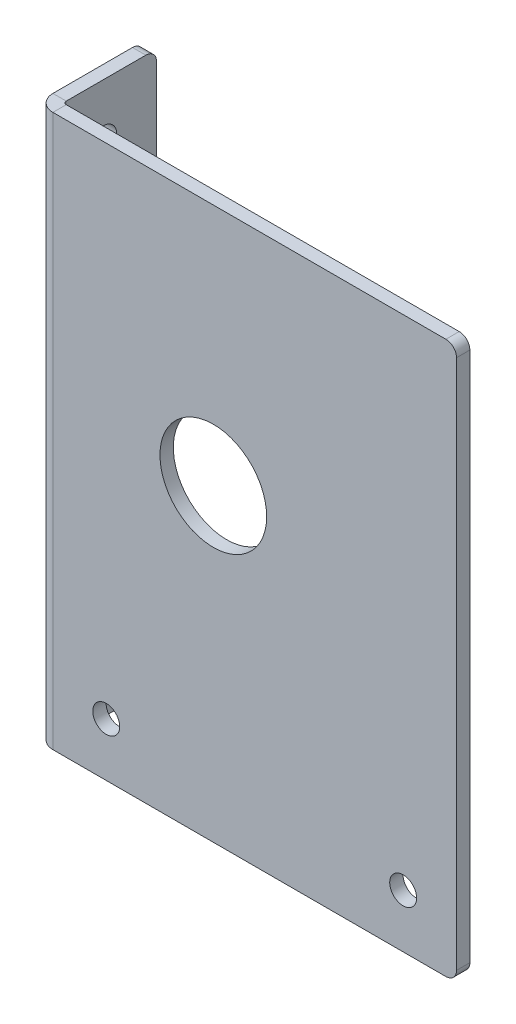
ISO-10303-21;
HEADER;
FILE_DESCRIPTION(('STEP AP214'),'2;1');
FILE_NAME('part.step','',(''),(''),'','','');
FILE_SCHEMA(('AUTOMOTIVE_DESIGN { 1 0 10303 214 1 1 1 1 }'));
ENDSEC;
DATA;
#1=APPLICATION_CONTEXT('core data for automotive mechanical design processes');
#2=APPLICATION_PROTOCOL_DEFINITION('international standard','automotive_design',2000,#1);
#3=PRODUCT_CONTEXT('',#1,'mechanical');
#4=PRODUCT('Part','Part','',(#3));
#5=PRODUCT_RELATED_PRODUCT_CATEGORY('part','',(#4));
#6=PRODUCT_DEFINITION_FORMATION('','',#4);
#7=PRODUCT_DEFINITION_CONTEXT('part definition',#1,'design');
#8=PRODUCT_DEFINITION('design','',#6,#7);
#9=PRODUCT_DEFINITION_SHAPE('','',#8);
#10=(LENGTH_UNIT() NAMED_UNIT(*) SI_UNIT(.MILLI.,.METRE.));
#11=(NAMED_UNIT(*) PLANE_ANGLE_UNIT() SI_UNIT($,.RADIAN.));
#12=(NAMED_UNIT(*) SI_UNIT($,.STERADIAN.) SOLID_ANGLE_UNIT());
#13=UNCERTAINTY_MEASURE_WITH_UNIT(LENGTH_MEASURE(1.E-05),#10,'distance_accuracy_value','');
#14=(GEOMETRIC_REPRESENTATION_CONTEXT(3) GLOBAL_UNCERTAINTY_ASSIGNED_CONTEXT((#13)) GLOBAL_UNIT_ASSIGNED_CONTEXT((#10,
#11,#12)) REPRESENTATION_CONTEXT('',''));
#15=CARTESIAN_POINT('',(0.,0.,0.));
#16=DIRECTION('',(0.,0.,1.));
#17=DIRECTION('',(1.,0.,0.));
#18=AXIS2_PLACEMENT_3D('',#15,#16,#17);
#19=CARTESIAN_POINT('',(-50.,65.7,3.175));
#20=DIRECTION('',(0.,-1.,0.));
#21=DIRECTION('',(1.,0.,0.));
#22=AXIS2_PLACEMENT_3D('',#19,#20,#21);
#23=PLANE('',#22);
#24=DIRECTION('',(-1.,0.,0.));
#25=VECTOR('',#24,1.);
#26=CARTESIAN_POINT('',(-50.,65.7,3.175));
#27=LINE('',#26,#25);
#28=CARTESIAN_POINT('',(47.46,65.7,3.175));
#29=VERTEX_POINT('',#28);
#30=CARTESIAN_POINT('',(-46.0884,65.7,3.175));
#31=VERTEX_POINT('',#30);
#32=EDGE_CURVE('E226',#29,#31,#27,.T.);
#33=ORIENTED_EDGE('',*,*,#32,.F.);
#34=DIRECTION('',(0.,0.,-1.));
#35=VECTOR('',#34,1.);
#36=CARTESIAN_POINT('',(47.46,65.7,3.175));
#37=LINE('',#36,#35);
#38=CARTESIAN_POINT('',(47.46,65.7,0.));
#39=VERTEX_POINT('',#38);
#40=EDGE_CURVE('E13',#29,#39,#37,.T.);
#41=ORIENTED_EDGE('',*,*,#40,.T.);
#42=DIRECTION('',(-1.,0.,0.));
#43=VECTOR('',#42,1.);
#44=CARTESIAN_POINT('',(-50.,65.7,0.));
#45=LINE('',#44,#43);
#46=CARTESIAN_POINT('',(-46.0884,65.7,0.));
#47=VERTEX_POINT('',#46);
#48=EDGE_CURVE('E224',#39,#47,#45,.T.);
#49=ORIENTED_EDGE('',*,*,#48,.T.);
#50=DIRECTION('',(0.,0.,1.));
#51=VECTOR('',#50,1.);
#52=CARTESIAN_POINT('',(-46.0884,65.7,0.));
#53=LINE('',#52,#51);
#54=EDGE_CURVE('E214',#47,#31,#53,.T.);
#55=ORIENTED_EDGE('',*,*,#54,.T.);
#56=EDGE_LOOP('',(#33,#41,#49,#55));
#57=FACE_BOUND('',#56,.T.);
#58=ADVANCED_FACE('F65',(#57),#23,.F.);
#59=CARTESIAN_POINT('',(-50.,-65.7,3.175));
#60=DIRECTION('',(0.,1.,0.));
#61=DIRECTION('',(-1.,0.,0.));
#62=AXIS2_PLACEMENT_3D('',#59,#60,#61);
#63=PLANE('',#62);
#64=DIRECTION('',(1.,0.,0.));
#65=VECTOR('',#64,1.);
#66=CARTESIAN_POINT('',(-50.,-65.7,0.));
#67=LINE('',#66,#65);
#68=CARTESIAN_POINT('',(-46.0884,-65.6999999999999,0.));
#69=VERTEX_POINT('',#68);
#70=CARTESIAN_POINT('',(47.46,-65.7,0.));
#71=VERTEX_POINT('',#70);
#72=EDGE_CURVE('E235',#69,#71,#67,.T.);
#73=ORIENTED_EDGE('',*,*,#72,.T.);
#74=DIRECTION('',(0.,0.,-1.));
#75=VECTOR('',#74,1.);
#76=CARTESIAN_POINT('',(47.46,-65.7,3.175));
#77=LINE('',#76,#75);
#78=CARTESIAN_POINT('',(47.46,-65.7,3.175));
#79=VERTEX_POINT('',#78);
#80=EDGE_CURVE('E89',#71,#79,#77,.F.);
#81=ORIENTED_EDGE('',*,*,#80,.T.);
#82=DIRECTION('',(1.,0.,0.));
#83=VECTOR('',#82,1.);
#84=CARTESIAN_POINT('',(-50.,-65.7,3.175));
#85=LINE('',#84,#83);
#86=CARTESIAN_POINT('',(-46.0884,-65.7,3.175));
#87=VERTEX_POINT('',#86);
#88=EDGE_CURVE('E228',#87,#79,#85,.T.);
#89=ORIENTED_EDGE('',*,*,#88,.F.);
#90=DIRECTION('',(0.,0.,1.));
#91=VECTOR('',#90,1.);
#92=CARTESIAN_POINT('',(-46.0884,-65.6999999999999,0.));
#93=LINE('',#92,#91);
#94=EDGE_CURVE('E221',#69,#87,#93,.T.);
#95=ORIENTED_EDGE('',*,*,#94,.F.);
#96=EDGE_LOOP('',(#73,#81,#89,#95));
#97=FACE_BOUND('',#96,.T.);
#98=ADVANCED_FACE('F281',(#97),#63,.F.);
#99=CARTESIAN_POINT('',(0.,0.,3.175));
#100=DIRECTION('',(0.,0.,1.));
#101=DIRECTION('',(1.,0.,0.));
#102=AXIS2_PLACEMENT_3D('',#99,#100,#101);
#103=PLANE('',#102);
#104=CARTESIAN_POINT('',(-33.3884,-52.9999999999999,3.175));
#105=DIRECTION('',(0.,0.,-1.));
#106=DIRECTION('',(-1.,0.,0.));
#107=AXIS2_PLACEMENT_3D('',#104,#105,#106);
#108=CIRCLE('',#107,3.20625370577771);
#109=CARTESIAN_POINT('',(-36.5946537057777,-52.9999999999999,3.175));
#110=VERTEX_POINT('',#109);
#111=EDGE_CURVE('E324',#110,#110,#108,.T.);
#112=ORIENTED_EDGE('',*,*,#111,.T.);
#113=EDGE_LOOP('',(#112));
#114=FACE_BOUND('',#113,.T.);
#115=CARTESIAN_POINT('',(37.3,-52.9999999999999,3.175));
#116=DIRECTION('',(0.,0.,-1.));
#117=DIRECTION('',(-1.,0.,0.));
#118=AXIS2_PLACEMENT_3D('',#115,#116,#117);
#119=CIRCLE('',#118,3.20625370577771);
#120=CARTESIAN_POINT('',(34.0937462942223,-52.9999999999999,3.175));
#121=VERTEX_POINT('',#120);
#122=EDGE_CURVE('E327',#121,#121,#119,.T.);
#123=ORIENTED_EDGE('',*,*,#122,.T.);
#124=EDGE_LOOP('',(#123));
#125=FACE_BOUND('',#124,.T.);
#126=CARTESIAN_POINT('',(-7.9,7.80000000000003,3.175));
#127=DIRECTION('',(0.,0.,1.));
#128=DIRECTION('',(1.,0.,0.));
#129=AXIS2_PLACEMENT_3D('',#126,#127,#128);
#130=CIRCLE('',#129,12.7);
#131=CARTESIAN_POINT('',(4.8,7.80000000000003,3.175));
#132=VERTEX_POINT('',#131);
#133=EDGE_CURVE('E311',#132,#132,#130,.T.);
#134=ORIENTED_EDGE('',*,*,#133,.F.);
#135=EDGE_LOOP('',(#134));
#136=FACE_BOUND('',#135,.T.);
#137=ORIENTED_EDGE('',*,*,#88,.T.);
#138=CARTESIAN_POINT('',(47.46,-63.16,3.175));
#139=DIRECTION('',(0.,0.,1.));
#140=DIRECTION('',(1.,0.,0.));
#141=AXIS2_PLACEMENT_3D('',#138,#139,#140);
#142=CIRCLE('',#141,2.54);
#143=CARTESIAN_POINT('',(50.,-63.16,3.175));
#144=VERTEX_POINT('',#143);
#145=EDGE_CURVE('E74',#79,#144,#142,.T.);
#146=ORIENTED_EDGE('',*,*,#145,.T.);
#147=DIRECTION('',(0.,1.,0.));
#148=VECTOR('',#147,1.);
#149=CARTESIAN_POINT('',(50.,-65.7,3.175));
#150=LINE('',#149,#148);
#151=CARTESIAN_POINT('',(50.,63.16,3.175));
#152=VERTEX_POINT('',#151);
#153=EDGE_CURVE('E231',#144,#152,#150,.T.);
#154=ORIENTED_EDGE('',*,*,#153,.T.);
#155=CARTESIAN_POINT('',(47.46,63.16,3.175));
#156=DIRECTION('',(0.,0.,1.));
#157=DIRECTION('',(1.,0.,0.));
#158=AXIS2_PLACEMENT_3D('',#155,#156,#157);
#159=CIRCLE('',#158,2.54);
#160=EDGE_CURVE('E81',#152,#29,#159,.T.);
#161=ORIENTED_EDGE('',*,*,#160,.T.);
#162=ORIENTED_EDGE('',*,*,#32,.T.);
#163=DIRECTION('',(0.,1.,0.));
#164=VECTOR('',#163,1.);
#165=CARTESIAN_POINT('',(-46.0884,65.7,3.175));
#166=LINE('',#165,#164);
#167=EDGE_CURVE('E166',#31,#87,#166,.F.);
#168=ORIENTED_EDGE('',*,*,#167,.T.);
#169=EDGE_LOOP('',(#137,#146,#154,#161,#162,#168));
#170=FACE_BOUND('',#169,.T.);
#171=ADVANCED_FACE('F268',(#114,#125,#136,#170),#103,.T.);
#172=CARTESIAN_POINT('',(0.,0.,0.));
#173=DIRECTION('',(0.,0.,1.));
#174=DIRECTION('',(1.,0.,0.));
#175=AXIS2_PLACEMENT_3D('',#172,#173,#174);
#176=PLANE('',#175);
#177=CARTESIAN_POINT('',(-33.3884,-52.9999999999999,0.));
#178=DIRECTION('',(0.,0.,-1.));
#179=DIRECTION('',(-1.,0.,0.));
#180=AXIS2_PLACEMENT_3D('',#177,#178,#179);
#181=CIRCLE('',#180,3.20625370577771);
#182=CARTESIAN_POINT('',(-36.5946537057777,-52.9999999999999,0.));
#183=VERTEX_POINT('',#182);
#184=EDGE_CURVE('E333',#183,#183,#181,.T.);
#185=ORIENTED_EDGE('',*,*,#184,.F.);
#186=EDGE_LOOP('',(#185));
#187=FACE_BOUND('',#186,.T.);
#188=CARTESIAN_POINT('',(37.3,-52.9999999999999,0.));
#189=DIRECTION('',(0.,0.,-1.));
#190=DIRECTION('',(-1.,0.,0.));
#191=AXIS2_PLACEMENT_3D('',#188,#189,#190);
#192=CIRCLE('',#191,3.20625370577771);
#193=CARTESIAN_POINT('',(34.0937462942223,-52.9999999999999,0.));
#194=VERTEX_POINT('',#193);
#195=EDGE_CURVE('E330',#194,#194,#192,.T.);
#196=ORIENTED_EDGE('',*,*,#195,.F.);
#197=EDGE_LOOP('',(#196));
#198=FACE_BOUND('',#197,.T.);
#199=CARTESIAN_POINT('',(-7.9,7.80000000000003,0.));
#200=DIRECTION('',(0.,0.,1.));
#201=DIRECTION('',(1.,0.,0.));
#202=AXIS2_PLACEMENT_3D('',#199,#200,#201);
#203=CIRCLE('',#202,12.7);
#204=CARTESIAN_POINT('',(4.8,7.80000000000003,0.));
#205=VERTEX_POINT('',#204);
#206=EDGE_CURVE('E69',#205,#205,#203,.T.);
#207=ORIENTED_EDGE('',*,*,#206,.T.);
#208=EDGE_LOOP('',(#207));
#209=FACE_BOUND('',#208,.T.);
#210=DIRECTION('',(0.,1.,0.));
#211=VECTOR('',#210,1.);
#212=CARTESIAN_POINT('',(50.,-65.7,0.));
#213=LINE('',#212,#211);
#214=CARTESIAN_POINT('',(50.,-63.16,0.));
#215=VERTEX_POINT('',#214);
#216=CARTESIAN_POINT('',(50.,63.16,0.));
#217=VERTEX_POINT('',#216);
#218=EDGE_CURVE('E229',#215,#217,#213,.T.);
#219=ORIENTED_EDGE('',*,*,#218,.F.);
#220=CARTESIAN_POINT('',(47.46,-63.16,0.));
#221=DIRECTION('',(0.,0.,1.));
#222=DIRECTION('',(1.,0.,0.));
#223=AXIS2_PLACEMENT_3D('',#220,#221,#222);
#224=CIRCLE('',#223,2.54);
#225=EDGE_CURVE('E262',#215,#71,#224,.F.);
#226=ORIENTED_EDGE('',*,*,#225,.T.);
#227=ORIENTED_EDGE('',*,*,#72,.F.);
#228=DIRECTION('',(0.,1.,0.));
#229=VECTOR('',#228,1.);
#230=CARTESIAN_POINT('',(-46.0884,65.7,0.));
#231=LINE('',#230,#229);
#232=EDGE_CURVE('E218',#47,#69,#231,.F.);
#233=ORIENTED_EDGE('',*,*,#232,.F.);
#234=ORIENTED_EDGE('',*,*,#48,.F.);
#235=CARTESIAN_POINT('',(47.46,63.16,0.));
#236=DIRECTION('',(0.,0.,1.));
#237=DIRECTION('',(1.,0.,0.));
#238=AXIS2_PLACEMENT_3D('',#235,#236,#237);
#239=CIRCLE('',#238,2.54);
#240=EDGE_CURVE('E260',#39,#217,#239,.F.);
#241=ORIENTED_EDGE('',*,*,#240,.T.);
#242=EDGE_LOOP('',(#219,#226,#227,#233,#234,#241));
#243=FACE_BOUND('',#242,.T.);
#244=ADVANCED_FACE('F278',(#187,#198,#209,#243),#176,.F.);
#245=CARTESIAN_POINT('',(50.,-65.7,3.175));
#246=DIRECTION('',(-1.,0.,0.));
#247=DIRECTION('',(0.,0.,1.));
#248=AXIS2_PLACEMENT_3D('',#245,#246,#247);
#249=PLANE('',#248);
#250=ORIENTED_EDGE('',*,*,#153,.F.);
#251=DIRECTION('',(0.,0.,-1.));
#252=VECTOR('',#251,1.);
#253=CARTESIAN_POINT('',(50.,-63.16,3.175));
#254=LINE('',#253,#252);
#255=EDGE_CURVE('E257',#144,#215,#254,.T.);
#256=ORIENTED_EDGE('',*,*,#255,.T.);
#257=ORIENTED_EDGE('',*,*,#218,.T.);
#258=DIRECTION('',(0.,0.,-1.));
#259=VECTOR('',#258,1.);
#260=CARTESIAN_POINT('',(50.,63.16,3.175));
#261=LINE('',#260,#259);
#262=EDGE_CURVE('E255',#217,#152,#261,.F.);
#263=ORIENTED_EDGE('',*,*,#262,.T.);
#264=EDGE_LOOP('',(#250,#256,#257,#263));
#265=FACE_BOUND('',#264,.T.);
#266=ADVANCED_FACE('F272',(#265),#249,.F.);
#267=CARTESIAN_POINT('',(-46.0884,-65.6999999999999,-0.736599999999999));
#268=DIRECTION('',(0.,-1.,0.));
#269=DIRECTION('',(0.,0.,-1.));
#270=AXIS2_PLACEMENT_3D('',#267,#268,#269);
#271=PLANE('',#270);
#272=DIRECTION('',(1.,0.,0.));
#273=VECTOR('',#272,1.);
#274=CARTESIAN_POINT('',(-50.,-65.7,-0.736599999999986));
#275=LINE('',#274,#273);
#276=CARTESIAN_POINT('',(-46.825,-65.6999999999999,-0.736599999999997));
#277=VERTEX_POINT('',#276);
#278=CARTESIAN_POINT('',(-50.,-65.6999999999999,-0.736599999999986));
#279=VERTEX_POINT('',#278);
#280=EDGE_CURVE('E209',#277,#279,#275,.F.);
#281=ORIENTED_EDGE('',*,*,#280,.F.);
#282=CARTESIAN_POINT('',(-46.0884,-65.6999999999999,-0.736599999999999));
#283=DIRECTION('',(0.,1.,0.));
#284=DIRECTION('',(0.,0.,1.));
#285=AXIS2_PLACEMENT_3D('',#282,#283,#284);
#286=CIRCLE('',#285,0.736599999999997);
#287=EDGE_CURVE('E170',#69,#277,#286,.F.);
#288=ORIENTED_EDGE('',*,*,#287,.F.);
#289=ORIENTED_EDGE('',*,*,#94,.T.);
#290=CARTESIAN_POINT('',(-46.0884,-65.6999999999999,-0.736599999999999));
#291=DIRECTION('',(0.,1.,0.));
#292=DIRECTION('',(0.,0.,1.));
#293=AXIS2_PLACEMENT_3D('',#290,#291,#292);
#294=CIRCLE('',#293,3.9116);
#295=EDGE_CURVE('E213',#87,#279,#294,.F.);
#296=ORIENTED_EDGE('',*,*,#295,.T.);
#297=EDGE_LOOP('',(#281,#288,#289,#296));
#298=FACE_BOUND('',#297,.T.);
#299=ADVANCED_FACE('F285',(#298),#271,.T.);
#300=CARTESIAN_POINT('',(-46.0884,65.7,-0.736599999999999));
#301=DIRECTION('',(0.,-1.,0.));
#302=DIRECTION('',(0.,0.,-1.));
#303=AXIS2_PLACEMENT_3D('',#300,#301,#302);
#304=PLANE('',#303);
#305=CARTESIAN_POINT('',(-46.0884,65.7,-0.736599999999999));
#306=DIRECTION('',(0.,1.,0.));
#307=DIRECTION('',(0.,0.,1.));
#308=AXIS2_PLACEMENT_3D('',#305,#306,#307);
#309=CIRCLE('',#308,0.736599999999997);
#310=CARTESIAN_POINT('',(-46.825,65.7,-0.736599999999997));
#311=VERTEX_POINT('',#310);
#312=EDGE_CURVE('E177',#311,#47,#309,.T.);
#313=ORIENTED_EDGE('',*,*,#312,.F.);
#314=DIRECTION('',(1.,0.,0.));
#315=VECTOR('',#314,1.);
#316=CARTESIAN_POINT('',(-46.825,65.7,-0.736599999999997));
#317=LINE('',#316,#315);
#318=CARTESIAN_POINT('',(-50.,65.7,-0.736599999999986));
#319=VERTEX_POINT('',#318);
#320=EDGE_CURVE('E174',#311,#319,#317,.F.);
#321=ORIENTED_EDGE('',*,*,#320,.T.);
#322=CARTESIAN_POINT('',(-46.0884,65.7,-0.736599999999999));
#323=DIRECTION('',(0.,1.,0.));
#324=DIRECTION('',(0.,0.,1.));
#325=AXIS2_PLACEMENT_3D('',#322,#323,#324);
#326=CIRCLE('',#325,3.9116);
#327=EDGE_CURVE('E159',#319,#31,#326,.T.);
#328=ORIENTED_EDGE('',*,*,#327,.T.);
#329=ORIENTED_EDGE('',*,*,#54,.F.);
#330=EDGE_LOOP('',(#313,#321,#328,#329));
#331=FACE_BOUND('',#330,.T.);
#332=ADVANCED_FACE('F175',(#331),#304,.F.);
#333=CARTESIAN_POINT('',(-46.0884,65.7,-0.736599999999999));
#334=DIRECTION('',(0.,1.,0.));
#335=DIRECTION('',(-1.,0.,0.));
#336=AXIS2_PLACEMENT_3D('',#333,#334,#335);
#337=CYLINDRICAL_SURFACE('',#336,3.9116);
#338=ORIENTED_EDGE('',*,*,#167,.F.);
#339=ORIENTED_EDGE('',*,*,#327,.F.);
#340=DIRECTION('',(0.,1.,0.));
#341=VECTOR('',#340,1.);
#342=CARTESIAN_POINT('',(-50.,-65.7,-0.736599999999986));
#343=LINE('',#342,#341);
#344=EDGE_CURVE('E163',#319,#279,#343,.F.);
#345=ORIENTED_EDGE('',*,*,#344,.T.);
#346=ORIENTED_EDGE('',*,*,#295,.F.);
#347=EDGE_LOOP('',(#338,#339,#345,#346));
#348=FACE_BOUND('',#347,.T.);
#349=ADVANCED_FACE('F161',(#348),#337,.T.);
#350=CARTESIAN_POINT('',(-46.0884,65.7,-0.736599999999999));
#351=DIRECTION('',(0.,1.,0.));
#352=DIRECTION('',(-1.,0.,0.));
#353=AXIS2_PLACEMENT_3D('',#350,#351,#352);
#354=CYLINDRICAL_SURFACE('',#353,0.736599999999997);
#355=ORIENTED_EDGE('',*,*,#232,.T.);
#356=ORIENTED_EDGE('',*,*,#287,.T.);
#357=DIRECTION('',(0.,1.,0.));
#358=VECTOR('',#357,1.);
#359=CARTESIAN_POINT('',(-46.825,-65.7,-0.736599999999997));
#360=LINE('',#359,#358);
#361=EDGE_CURVE('E182',#277,#311,#360,.T.);
#362=ORIENTED_EDGE('',*,*,#361,.T.);
#363=ORIENTED_EDGE('',*,*,#312,.T.);
#364=EDGE_LOOP('',(#355,#356,#362,#363));
#365=FACE_BOUND('',#364,.T.);
#366=ADVANCED_FACE('F291',(#365),#354,.F.);
#367=CARTESIAN_POINT('',(-50.0000000000001,65.7,-22.225));
#368=DIRECTION('',(0.,-1.,0.));
#369=DIRECTION('',(0.,0.,-1.));
#370=AXIS2_PLACEMENT_3D('',#367,#368,#369);
#371=PLANE('',#370);
#372=DIRECTION('',(0.,0.,1.));
#373=VECTOR('',#372,1.);
#374=CARTESIAN_POINT('',(-46.8250000000001,65.7,-22.225));
#375=LINE('',#374,#373);
#376=CARTESIAN_POINT('',(-46.8250000000001,65.7,-19.685));
#377=VERTEX_POINT('',#376);
#378=EDGE_CURVE('E192',#311,#377,#375,.F.);
#379=ORIENTED_EDGE('',*,*,#378,.T.);
#380=DIRECTION('',(1.,0.,0.));
#381=VECTOR('',#380,1.);
#382=CARTESIAN_POINT('',(-50.0000000000001,65.7,-19.685));
#383=LINE('',#382,#381);
#384=CARTESIAN_POINT('',(-50.0000000000001,65.7,-19.685));
#385=VERTEX_POINT('',#384);
#386=EDGE_CURVE('E196',#377,#385,#383,.F.);
#387=ORIENTED_EDGE('',*,*,#386,.T.);
#388=DIRECTION('',(0.,0.,-1.));
#389=VECTOR('',#388,1.);
#390=CARTESIAN_POINT('',(-50.,65.7,1.82801612852581E-13));
#391=LINE('',#390,#389);
#392=EDGE_CURVE('E188',#319,#385,#391,.T.);
#393=ORIENTED_EDGE('',*,*,#392,.F.);
#394=ORIENTED_EDGE('',*,*,#320,.F.);
#395=EDGE_LOOP('',(#379,#387,#393,#394));
#396=FACE_BOUND('',#395,.T.);
#397=ADVANCED_FACE('F194',(#396),#371,.F.);
#398=CARTESIAN_POINT('',(-50.,-65.7,0.));
#399=DIRECTION('',(0.,1.,0.));
#400=DIRECTION('',(0.,0.,1.));
#401=AXIS2_PLACEMENT_3D('',#398,#399,#400);
#402=PLANE('',#401);
#403=DIRECTION('',(0.,0.,1.));
#404=VECTOR('',#403,1.);
#405=CARTESIAN_POINT('',(-50.,-65.7,1.82801612852581E-13));
#406=LINE('',#405,#404);
#407=CARTESIAN_POINT('',(-50.0000000000001,-65.7,-19.685));
#408=VERTEX_POINT('',#407);
#409=EDGE_CURVE('E191',#408,#279,#406,.T.);
#410=ORIENTED_EDGE('',*,*,#409,.F.);
#411=DIRECTION('',(1.,0.,0.));
#412=VECTOR('',#411,1.);
#413=CARTESIAN_POINT('',(-50.0000000000001,-65.7,-19.685));
#414=LINE('',#413,#412);
#415=CARTESIAN_POINT('',(-46.8250000000001,-65.7,-19.685));
#416=VERTEX_POINT('',#415);
#417=EDGE_CURVE('E233',#408,#416,#414,.T.);
#418=ORIENTED_EDGE('',*,*,#417,.T.);
#419=DIRECTION('',(0.,0.,-1.));
#420=VECTOR('',#419,1.);
#421=CARTESIAN_POINT('',(-46.825,-65.7,0.));
#422=LINE('',#421,#420);
#423=EDGE_CURVE('E198',#416,#277,#422,.F.);
#424=ORIENTED_EDGE('',*,*,#423,.T.);
#425=ORIENTED_EDGE('',*,*,#280,.T.);
#426=EDGE_LOOP('',(#410,#418,#424,#425));
#427=FACE_BOUND('',#426,.T.);
#428=ADVANCED_FACE('F309',(#427),#402,.F.);
#429=CARTESIAN_POINT('',(-50.,0.,1.82801612852581E-13));
#430=DIRECTION('',(1.,0.,0.));
#431=DIRECTION('',(0.,0.,-1.));
#432=AXIS2_PLACEMENT_3D('',#429,#430,#431);
#433=PLANE('',#432);
#434=CARTESIAN_POINT('',(-50.0000000000002,-53.,-9.525));
#435=DIRECTION('',(-1.,0.,0.));
#436=DIRECTION('',(0.,0.,-1.));
#437=AXIS2_PLACEMENT_3D('',#434,#435,#436);
#438=CIRCLE('',#437,3.205);
#439=CARTESIAN_POINT('',(-50.0000000000002,-53.,-12.73));
#440=VERTEX_POINT('',#439);
#441=EDGE_CURVE('E318',#440,#440,#438,.T.);
#442=ORIENTED_EDGE('',*,*,#441,.F.);
#443=EDGE_LOOP('',(#442));
#444=FACE_BOUND('',#443,.T.);
#445=CARTESIAN_POINT('',(-50.0000000000001,53.,-9.525));
#446=DIRECTION('',(1.,0.,0.));
#447=DIRECTION('',(0.,0.,-1.));
#448=AXIS2_PLACEMENT_3D('',#445,#446,#447);
#449=CIRCLE('',#448,3.205);
#450=CARTESIAN_POINT('',(-50.0000000000001,53.,-12.73));
#451=VERTEX_POINT('',#450);
#452=EDGE_CURVE('E314',#451,#451,#449,.T.);
#453=ORIENTED_EDGE('',*,*,#452,.T.);
#454=EDGE_LOOP('',(#453));
#455=FACE_BOUND('',#454,.T.);
#456=DIRECTION('',(0.,-1.,0.));
#457=VECTOR('',#456,1.);
#458=CARTESIAN_POINT('',(-50.0000000000001,0.,-22.225));
#459=LINE('',#458,#457);
#460=CARTESIAN_POINT('',(-50.0000000000001,63.16,-22.225));
#461=VERTEX_POINT('',#460);
#462=CARTESIAN_POINT('',(-50.0000000000001,-63.16,-22.225));
#463=VERTEX_POINT('',#462);
#464=EDGE_CURVE('E197',#461,#463,#459,.T.);
#465=ORIENTED_EDGE('',*,*,#464,.T.);
#466=CARTESIAN_POINT('',(-50.0000000000001,-63.16,-19.685));
#467=DIRECTION('',(1.,0.,0.));
#468=DIRECTION('',(0.,0.,-1.));
#469=AXIS2_PLACEMENT_3D('',#466,#467,#468);
#470=CIRCLE('',#469,2.54);
#471=EDGE_CURVE('E252',#463,#408,#470,.F.);
#472=ORIENTED_EDGE('',*,*,#471,.T.);
#473=ORIENTED_EDGE('',*,*,#409,.T.);
#474=ORIENTED_EDGE('',*,*,#344,.F.);
#475=ORIENTED_EDGE('',*,*,#392,.T.);
#476=CARTESIAN_POINT('',(-50.0000000000001,63.16,-19.685));
#477=DIRECTION('',(1.,0.,0.));
#478=DIRECTION('',(0.,0.,-1.));
#479=AXIS2_PLACEMENT_3D('',#476,#477,#478);
#480=CIRCLE('',#479,2.54);
#481=EDGE_CURVE('E250',#385,#461,#480,.F.);
#482=ORIENTED_EDGE('',*,*,#481,.T.);
#483=EDGE_LOOP('',(#465,#472,#473,#474,#475,#482));
#484=FACE_BOUND('',#483,.T.);
#485=ADVANCED_FACE('F187',(#444,#455,#484),#433,.F.);
#486=CARTESIAN_POINT('',(-46.825,0.,1.71716159601754E-13));
#487=DIRECTION('',(1.,0.,0.));
#488=DIRECTION('',(0.,0.,-1.));
#489=AXIS2_PLACEMENT_3D('',#486,#487,#488);
#490=PLANE('',#489);
#491=CARTESIAN_POINT('',(-46.825,-53.,-9.52500000000001));
#492=DIRECTION('',(-1.,0.,0.));
#493=DIRECTION('',(0.,0.,-1.));
#494=AXIS2_PLACEMENT_3D('',#491,#492,#493);
#495=CIRCLE('',#494,3.205);
#496=CARTESIAN_POINT('',(-46.8250000000001,-53.,-12.73));
#497=VERTEX_POINT('',#496);
#498=EDGE_CURVE('E321',#497,#497,#495,.T.);
#499=ORIENTED_EDGE('',*,*,#498,.T.);
#500=EDGE_LOOP('',(#499));
#501=FACE_BOUND('',#500,.T.);
#502=CARTESIAN_POINT('',(-46.825,53.,-9.52500000000001));
#503=DIRECTION('',(1.,0.,0.));
#504=DIRECTION('',(0.,0.,-1.));
#505=AXIS2_PLACEMENT_3D('',#502,#503,#504);
#506=CIRCLE('',#505,3.205);
#507=CARTESIAN_POINT('',(-46.8250000000001,53.,-12.73));
#508=VERTEX_POINT('',#507);
#509=EDGE_CURVE('E315',#508,#508,#506,.T.);
#510=ORIENTED_EDGE('',*,*,#509,.F.);
#511=EDGE_LOOP('',(#510));
#512=FACE_BOUND('',#511,.T.);
#513=ORIENTED_EDGE('',*,*,#423,.F.);
#514=CARTESIAN_POINT('',(-46.8250000000001,-63.16,-19.685));
#515=DIRECTION('',(1.,0.,0.));
#516=DIRECTION('',(0.,0.,-1.));
#517=AXIS2_PLACEMENT_3D('',#514,#515,#516);
#518=CIRCLE('',#517,2.54);
#519=CARTESIAN_POINT('',(-46.8250000000001,-63.16,-22.225));
#520=VERTEX_POINT('',#519);
#521=EDGE_CURVE('E243',#416,#520,#518,.T.);
#522=ORIENTED_EDGE('',*,*,#521,.T.);
#523=DIRECTION('',(0.,1.,0.));
#524=VECTOR('',#523,1.);
#525=CARTESIAN_POINT('',(-46.8250000000001,-65.7,-22.225));
#526=LINE('',#525,#524);
#527=CARTESIAN_POINT('',(-46.8250000000001,63.16,-22.225));
#528=VERTEX_POINT('',#527);
#529=EDGE_CURVE('E201',#528,#520,#526,.F.);
#530=ORIENTED_EDGE('',*,*,#529,.F.);
#531=CARTESIAN_POINT('',(-46.8250000000001,63.16,-19.685));
#532=DIRECTION('',(1.,0.,0.));
#533=DIRECTION('',(0.,0.,-1.));
#534=AXIS2_PLACEMENT_3D('',#531,#532,#533);
#535=CIRCLE('',#534,2.54);
#536=EDGE_CURVE('E241',#528,#377,#535,.T.);
#537=ORIENTED_EDGE('',*,*,#536,.T.);
#538=ORIENTED_EDGE('',*,*,#378,.F.);
#539=ORIENTED_EDGE('',*,*,#361,.F.);
#540=EDGE_LOOP('',(#513,#522,#530,#537,#538,#539));
#541=FACE_BOUND('',#540,.T.);
#542=ADVANCED_FACE('F295',(#501,#512,#541),#490,.T.);
#543=CARTESIAN_POINT('',(-50.0000000000001,-65.7,-22.225));
#544=DIRECTION('',(0.,0.,1.));
#545=DIRECTION('',(1.,0.,0.));
#546=AXIS2_PLACEMENT_3D('',#543,#544,#545);
#547=PLANE('',#546);
#548=ORIENTED_EDGE('',*,*,#529,.T.);
#549=DIRECTION('',(1.,0.,0.));
#550=VECTOR('',#549,1.);
#551=CARTESIAN_POINT('',(-50.0000000000001,-63.16,-22.225));
#552=LINE('',#551,#550);
#553=EDGE_CURVE('E248',#520,#463,#552,.F.);
#554=ORIENTED_EDGE('',*,*,#553,.T.);
#555=ORIENTED_EDGE('',*,*,#464,.F.);
#556=DIRECTION('',(1.,0.,0.));
#557=VECTOR('',#556,1.);
#558=CARTESIAN_POINT('',(-50.0000000000001,63.16,-22.225));
#559=LINE('',#558,#557);
#560=EDGE_CURVE('E245',#461,#528,#559,.T.);
#561=ORIENTED_EDGE('',*,*,#560,.T.);
#562=EDGE_LOOP('',(#548,#554,#555,#561));
#563=FACE_BOUND('',#562,.T.);
#564=ADVANCED_FACE('F303',(#563),#547,.F.);
#565=CARTESIAN_POINT('',(-50.0000000000001,-63.16,-19.685));
#566=DIRECTION('',(1.,0.,0.));
#567=DIRECTION('',(0.,0.,-1.));
#568=AXIS2_PLACEMENT_3D('',#565,#566,#567);
#569=CYLINDRICAL_SURFACE('',#568,2.54);
#570=ORIENTED_EDGE('',*,*,#471,.F.);
#571=ORIENTED_EDGE('',*,*,#553,.F.);
#572=ORIENTED_EDGE('',*,*,#521,.F.);
#573=ORIENTED_EDGE('',*,*,#417,.F.);
#574=EDGE_LOOP('',(#570,#571,#572,#573));
#575=FACE_BOUND('',#574,.T.);
#576=ADVANCED_FACE('F306',(#575),#569,.T.);
#577=CARTESIAN_POINT('',(-50.0000000000001,63.16,-19.685));
#578=DIRECTION('',(1.,0.,0.));
#579=DIRECTION('',(0.,0.,-1.));
#580=AXIS2_PLACEMENT_3D('',#577,#578,#579);
#581=CYLINDRICAL_SURFACE('',#580,2.54);
#582=ORIENTED_EDGE('',*,*,#481,.F.);
#583=ORIENTED_EDGE('',*,*,#386,.F.);
#584=ORIENTED_EDGE('',*,*,#536,.F.);
#585=ORIENTED_EDGE('',*,*,#560,.F.);
#586=EDGE_LOOP('',(#582,#583,#584,#585));
#587=FACE_BOUND('',#586,.T.);
#588=ADVANCED_FACE('F298',(#587),#581,.T.);
#589=CARTESIAN_POINT('',(47.46,-63.16,3.175));
#590=DIRECTION('',(0.,0.,-1.));
#591=DIRECTION('',(-1.,0.,0.));
#592=AXIS2_PLACEMENT_3D('',#589,#590,#591);
#593=CYLINDRICAL_SURFACE('',#592,2.54);
#594=ORIENTED_EDGE('',*,*,#145,.F.);
#595=ORIENTED_EDGE('',*,*,#80,.F.);
#596=ORIENTED_EDGE('',*,*,#225,.F.);
#597=ORIENTED_EDGE('',*,*,#255,.F.);
#598=EDGE_LOOP('',(#594,#595,#596,#597));
#599=FACE_BOUND('',#598,.T.);
#600=ADVANCED_FACE('F275',(#599),#593,.T.);
#601=CARTESIAN_POINT('',(47.46,63.16,3.175));
#602=DIRECTION('',(0.,0.,-1.));
#603=DIRECTION('',(-1.,0.,0.));
#604=AXIS2_PLACEMENT_3D('',#601,#602,#603);
#605=CYLINDRICAL_SURFACE('',#604,2.54);
#606=ORIENTED_EDGE('',*,*,#160,.F.);
#607=ORIENTED_EDGE('',*,*,#262,.F.);
#608=ORIENTED_EDGE('',*,*,#240,.F.);
#609=ORIENTED_EDGE('',*,*,#40,.F.);
#610=EDGE_LOOP('',(#606,#607,#608,#609));
#611=FACE_BOUND('',#610,.T.);
#612=ADVANCED_FACE('F67',(#611),#605,.T.);
#613=CARTESIAN_POINT('',(-7.9,7.80000000000003,-22.225));
#614=DIRECTION('',(0.,0.,1.));
#615=DIRECTION('',(1.,0.,0.));
#616=AXIS2_PLACEMENT_3D('',#613,#614,#615);
#617=CYLINDRICAL_SURFACE('',#616,12.7);
#618=ORIENTED_EDGE('',*,*,#133,.T.);
#619=EDGE_LOOP('',(#618));
#620=FACE_BOUND('',#619,.T.);
#621=ORIENTED_EDGE('',*,*,#206,.F.);
#622=EDGE_LOOP('',(#621));
#623=FACE_BOUND('',#622,.T.);
#624=ADVANCED_FACE('F356',(#620,#623),#617,.F.);
#625=CARTESIAN_POINT('',(-50.0000000000001,53.,-9.525));
#626=DIRECTION('',(1.,0.,0.));
#627=DIRECTION('',(0.,0.,-1.));
#628=AXIS2_PLACEMENT_3D('',#625,#626,#627);
#629=CYLINDRICAL_SURFACE('',#628,3.205);
#630=ORIENTED_EDGE('',*,*,#452,.F.);
#631=EDGE_LOOP('',(#630));
#632=FACE_BOUND('',#631,.T.);
#633=ORIENTED_EDGE('',*,*,#509,.T.);
#634=EDGE_LOOP('',(#633));
#635=FACE_BOUND('',#634,.T.);
#636=ADVANCED_FACE('F358',(#632,#635),#629,.F.);
#637=CARTESIAN_POINT('',(-50.0000000000002,-53.,-9.525));
#638=DIRECTION('',(1.,0.,0.));
#639=DIRECTION('',(0.,0.,-1.));
#640=AXIS2_PLACEMENT_3D('',#637,#638,#639);
#641=CYLINDRICAL_SURFACE('',#640,3.205);
#642=ORIENTED_EDGE('',*,*,#441,.T.);
#643=EDGE_LOOP('',(#642));
#644=FACE_BOUND('',#643,.T.);
#645=ORIENTED_EDGE('',*,*,#498,.F.);
#646=EDGE_LOOP('',(#645));
#647=FACE_BOUND('',#646,.T.);
#648=ADVANCED_FACE('F365',(#644,#647),#641,.F.);
#649=CARTESIAN_POINT('',(37.3,-52.9999999999999,3.175));
#650=DIRECTION('',(0.,0.,-1.));
#651=DIRECTION('',(-1.,0.,0.));
#652=AXIS2_PLACEMENT_3D('',#649,#650,#651);
#653=CYLINDRICAL_SURFACE('',#652,3.20625370577771);
#654=ORIENTED_EDGE('',*,*,#122,.F.);
#655=EDGE_LOOP('',(#654));
#656=FACE_BOUND('',#655,.T.);
#657=ORIENTED_EDGE('',*,*,#195,.T.);
#658=EDGE_LOOP('',(#657));
#659=FACE_BOUND('',#658,.T.);
#660=ADVANCED_FACE('F344',(#656,#659),#653,.F.);
#661=CARTESIAN_POINT('',(-33.3884,-52.9999999999999,3.175));
#662=DIRECTION('',(0.,0.,-1.));
#663=DIRECTION('',(-1.,0.,0.));
#664=AXIS2_PLACEMENT_3D('',#661,#662,#663);
#665=CYLINDRICAL_SURFACE('',#664,3.20625370577771);
#666=ORIENTED_EDGE('',*,*,#111,.F.);
#667=EDGE_LOOP('',(#666));
#668=FACE_BOUND('',#667,.T.);
#669=ORIENTED_EDGE('',*,*,#184,.T.);
#670=EDGE_LOOP('',(#669));
#671=FACE_BOUND('',#670,.T.);
#672=ADVANCED_FACE('F341',(#668,#671),#665,.F.);
#673=CLOSED_SHELL('',(#58,#98,#171,#244,#266,#299,#332,#349,#366,#397,#428,#485,#542,#564,#576,
#588,#600,#612,#624,#636,#648,#660,#672));
#674=MANIFOLD_SOLID_BREP('B2',#673);
#675=ADVANCED_BREP_SHAPE_REPRESENTATION('',(#18,#674),#14);
#676=SHAPE_DEFINITION_REPRESENTATION(#9,#675);
ENDSEC;
END-ISO-10303-21;
